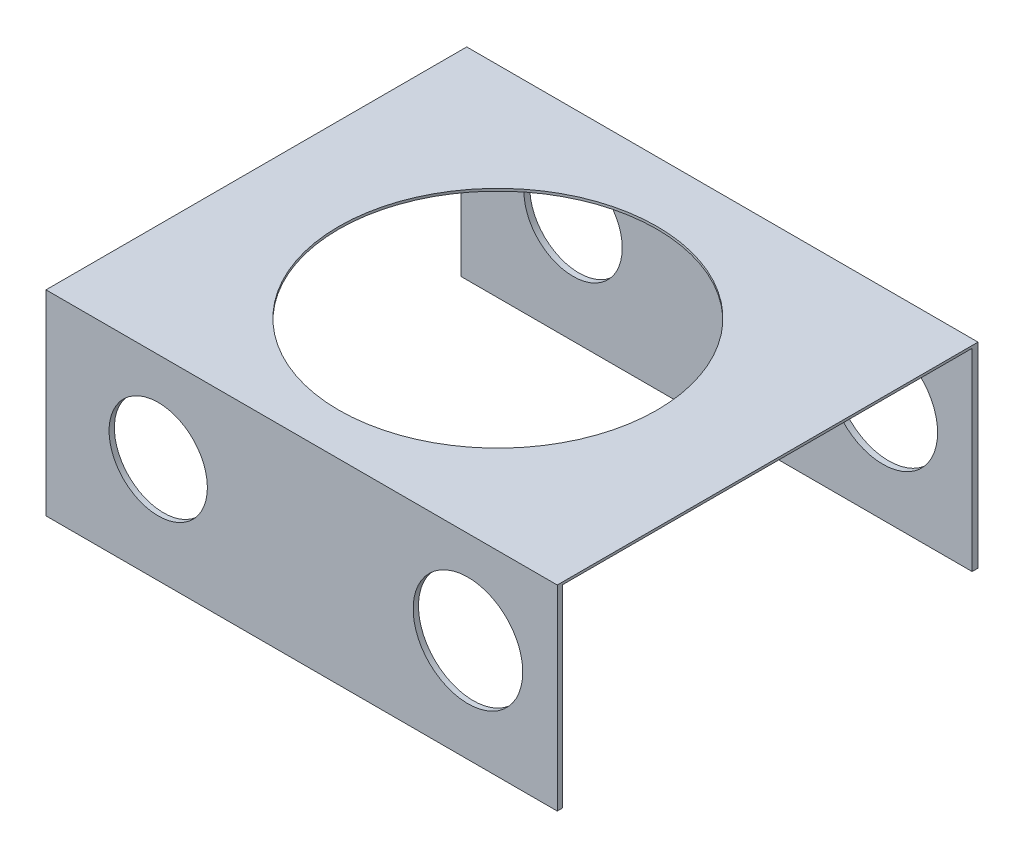
ISO-10303-21;
HEADER;
FILE_DESCRIPTION(('STEP AP214'),'2;1');
FILE_NAME('part.step','',(''),(''),'','','');
FILE_SCHEMA(('AUTOMOTIVE_DESIGN { 1 0 10303 214 1 1 1 1 }'));
ENDSEC;
DATA;
#1=APPLICATION_CONTEXT('core data for automotive mechanical design processes');
#2=APPLICATION_PROTOCOL_DEFINITION('international standard','automotive_design',2000,#1);
#3=PRODUCT_CONTEXT('',#1,'mechanical');
#4=PRODUCT('Part','Part','',(#3));
#5=PRODUCT_RELATED_PRODUCT_CATEGORY('part','',(#4));
#6=PRODUCT_DEFINITION_FORMATION('','',#4);
#7=PRODUCT_DEFINITION_CONTEXT('part definition',#1,'design');
#8=PRODUCT_DEFINITION('design','',#6,#7);
#9=PRODUCT_DEFINITION_SHAPE('','',#8);
#10=(LENGTH_UNIT() NAMED_UNIT(*) SI_UNIT(.MILLI.,.METRE.));
#11=(NAMED_UNIT(*) PLANE_ANGLE_UNIT() SI_UNIT($,.RADIAN.));
#12=(NAMED_UNIT(*) SI_UNIT($,.STERADIAN.) SOLID_ANGLE_UNIT());
#13=UNCERTAINTY_MEASURE_WITH_UNIT(LENGTH_MEASURE(1.E-05),#10,'distance_accuracy_value','');
#14=(GEOMETRIC_REPRESENTATION_CONTEXT(3) GLOBAL_UNCERTAINTY_ASSIGNED_CONTEXT((#13)) GLOBAL_UNIT_ASSIGNED_CONTEXT((#10,
#11,#12)) REPRESENTATION_CONTEXT('',''));
#15=CARTESIAN_POINT('',(0.,0.,0.));
#16=DIRECTION('',(0.,0.,1.));
#17=DIRECTION('',(1.,0.,0.));
#18=AXIS2_PLACEMENT_3D('',#15,#16,#17);
#19=CARTESIAN_POINT('',(0.,-15.,0.));
#20=DIRECTION('',(0.,1.,0.));
#21=DIRECTION('',(0.,0.,1.));
#22=AXIS2_PLACEMENT_3D('',#19,#20,#21);
#23=PLANE('',#22);
#24=DIRECTION('',(0.,0.,1.));
#25=VECTOR('',#24,1.);
#26=CARTESIAN_POINT('',(-45.1710778309643,-15.,1.54135324161621E-13));
#27=LINE('',#26,#25);
#28=CARTESIAN_POINT('',(-45.1710778309643,-15.,-39.5079014077137));
#29=VERTEX_POINT('',#28);
#30=CARTESIAN_POINT('',(-45.1710778309644,-15.,-38.45203678224));
#31=VERTEX_POINT('',#30);
#32=EDGE_CURVE('E108',#29,#31,#27,.T.);
#33=ORIENTED_EDGE('',*,*,#32,.F.);
#34=DIRECTION('',(1.,0.,0.));
#35=VECTOR('',#34,1.);
#36=CARTESIAN_POINT('',(0.,-15.,-39.5079014077137));
#37=LINE('',#36,#35);
#38=CARTESIAN_POINT('',(46.7439487612496,-15.,-39.5079014077137));
#39=VERTEX_POINT('',#38);
#40=EDGE_CURVE('E121',#29,#39,#37,.T.);
#41=ORIENTED_EDGE('',*,*,#40,.T.);
#42=DIRECTION('',(0.,0.,1.));
#43=VECTOR('',#42,1.);
#44=CARTESIAN_POINT('',(46.7439487612496,-15.,0.));
#45=LINE('',#44,#43);
#46=CARTESIAN_POINT('',(46.7439487612496,-15.,-38.45203678224));
#47=VERTEX_POINT('',#46);
#48=EDGE_CURVE('E132',#39,#47,#45,.T.);
#49=ORIENTED_EDGE('',*,*,#48,.T.);
#50=DIRECTION('',(-1.,0.,0.));
#51=VECTOR('',#50,1.);
#52=CARTESIAN_POINT('',(0.,-15.,-38.45203678224));
#53=LINE('',#52,#51);
#54=EDGE_CURVE('E48',#47,#31,#53,.T.);
#55=ORIENTED_EDGE('',*,*,#54,.T.);
#56=EDGE_LOOP('',(#33,#41,#49,#55));
#57=FACE_BOUND('',#56,.T.);
#58=ADVANCED_FACE('F38',(#57),#23,.F.);
#59=CARTESIAN_POINT('',(0.,-15.,36.1311257288747));
#60=DIRECTION('',(0.,0.,1.));
#61=DIRECTION('',(1.,0.,0.));
#62=AXIS2_PLACEMENT_3D('',#59,#60,#61);
#63=PLANE('',#62);
#64=CARTESIAN_POINT('',(30.686426908304,3.53131120888559,36.1311257288747));
#65=DIRECTION('',(0.,0.,1.));
#66=DIRECTION('',(1.,0.,0.));
#67=AXIS2_PLACEMENT_3D('',#64,#65,#66);
#68=CIRCLE('',#67,9.85217033037218);
#69=CARTESIAN_POINT('',(40.5385972386762,3.53131120888559,36.1311257288747));
#70=VERTEX_POINT('',#69);
#71=EDGE_CURVE('E168',#70,#70,#68,.T.);
#72=ORIENTED_EDGE('',*,*,#71,.F.);
#73=EDGE_LOOP('',(#72));
#74=FACE_BOUND('',#73,.T.);
#75=CARTESIAN_POINT('',(-24.9961801071572,3.92344224420574,36.1311257288747));
#76=DIRECTION('',(0.,0.,1.));
#77=DIRECTION('',(1.,0.,0.));
#78=AXIS2_PLACEMENT_3D('',#75,#76,#77);
#79=CIRCLE('',#78,8.83655346592237);
#80=CARTESIAN_POINT('',(-16.1596266412349,3.92344224420574,36.1311257288747));
#81=VERTEX_POINT('',#80);
#82=EDGE_CURVE('E180',#81,#81,#79,.T.);
#83=ORIENTED_EDGE('',*,*,#82,.F.);
#84=EDGE_LOOP('',(#83));
#85=FACE_BOUND('',#84,.T.);
#86=DIRECTION('',(1.,0.,0.));
#87=VECTOR('',#86,1.);
#88=CARTESIAN_POINT('',(0.,20.2,36.1311257288747));
#89=LINE('',#88,#87);
#90=CARTESIAN_POINT('',(-45.1710778309643,20.2,36.1311257288747));
#91=VERTEX_POINT('',#90);
#92=CARTESIAN_POINT('',(46.7439487612496,20.2,36.1311257288747));
#93=VERTEX_POINT('',#92);
#94=EDGE_CURVE('E222',#91,#93,#89,.T.);
#95=ORIENTED_EDGE('',*,*,#94,.F.);
#96=DIRECTION('',(0.,1.,0.));
#97=VECTOR('',#96,1.);
#98=CARTESIAN_POINT('',(-45.1710778309643,-15.,36.1311257288747));
#99=LINE('',#98,#97);
#100=CARTESIAN_POINT('',(-45.1710778309643,-15.,36.1311257288747));
#101=VERTEX_POINT('',#100);
#102=EDGE_CURVE('E116',#101,#91,#99,.T.);
#103=ORIENTED_EDGE('',*,*,#102,.F.);
#104=DIRECTION('',(1.,0.,0.));
#105=VECTOR('',#104,1.);
#106=CARTESIAN_POINT('',(0.,-15.,36.1311257288747));
#107=LINE('',#106,#105);
#108=CARTESIAN_POINT('',(46.7439487612496,-15.,36.1311257288747));
#109=VERTEX_POINT('',#108);
#110=EDGE_CURVE('E131',#101,#109,#107,.T.);
#111=ORIENTED_EDGE('',*,*,#110,.T.);
#112=DIRECTION('',(0.,1.,0.));
#113=VECTOR('',#112,1.);
#114=CARTESIAN_POINT('',(46.7439487612496,-15.,36.1311257288747));
#115=LINE('',#114,#113);
#116=EDGE_CURVE('E141',#109,#93,#115,.T.);
#117=ORIENTED_EDGE('',*,*,#116,.T.);
#118=EDGE_LOOP('',(#95,#103,#111,#117));
#119=FACE_BOUND('',#118,.T.);
#120=ADVANCED_FACE('F237',(#74,#85,#119),#63,.T.);
#121=CARTESIAN_POINT('',(0.,-15.,-39.5079014077137));
#122=DIRECTION('',(0.,0.,1.));
#123=DIRECTION('',(1.,0.,0.));
#124=AXIS2_PLACEMENT_3D('',#121,#122,#123);
#125=PLANE('',#124);
#126=CARTESIAN_POINT('',(30.686426908304,3.53131120888559,-39.5079014077137));
#127=DIRECTION('',(0.,0.,1.));
#128=DIRECTION('',(1.,0.,0.));
#129=AXIS2_PLACEMENT_3D('',#126,#127,#128);
#130=CIRCLE('',#129,9.85217033037218);
#131=CARTESIAN_POINT('',(40.5385972386762,3.53131120888559,-39.5079014077137));
#132=VERTEX_POINT('',#131);
#133=EDGE_CURVE('E160',#132,#132,#130,.T.);
#134=ORIENTED_EDGE('',*,*,#133,.T.);
#135=EDGE_LOOP('',(#134));
#136=FACE_BOUND('',#135,.T.);
#137=CARTESIAN_POINT('',(-24.9961801071572,3.92344224420574,-39.5079014077137));
#138=DIRECTION('',(0.,0.,1.));
#139=DIRECTION('',(1.,0.,0.));
#140=AXIS2_PLACEMENT_3D('',#137,#138,#139);
#141=CIRCLE('',#140,8.83655346592237);
#142=CARTESIAN_POINT('',(-16.1596266412349,3.92344224420574,-39.5079014077137));
#143=VERTEX_POINT('',#142);
#144=EDGE_CURVE('E174',#143,#143,#141,.T.);
#145=ORIENTED_EDGE('',*,*,#144,.T.);
#146=EDGE_LOOP('',(#145));
#147=FACE_BOUND('',#146,.T.);
#148=DIRECTION('',(0.,1.,0.));
#149=VECTOR('',#148,1.);
#150=CARTESIAN_POINT('',(-45.1710778309643,-15.,-39.5079014077137));
#151=LINE('',#150,#149);
#152=CARTESIAN_POINT('',(-45.1710778309643,20.2,-39.5079014077137));
#153=VERTEX_POINT('',#152);
#154=EDGE_CURVE('E105',#29,#153,#151,.T.);
#155=ORIENTED_EDGE('',*,*,#154,.T.);
#156=DIRECTION('',(1.,0.,0.));
#157=VECTOR('',#156,1.);
#158=CARTESIAN_POINT('',(0.,20.2,-39.5079014077137));
#159=LINE('',#158,#157);
#160=CARTESIAN_POINT('',(46.7439487612496,20.2,-39.5079014077137));
#161=VERTEX_POINT('',#160);
#162=EDGE_CURVE('E220',#153,#161,#159,.T.);
#163=ORIENTED_EDGE('',*,*,#162,.T.);
#164=DIRECTION('',(0.,1.,0.));
#165=VECTOR('',#164,1.);
#166=CARTESIAN_POINT('',(46.7439487612496,-15.,-39.5079014077137));
#167=LINE('',#166,#165);
#168=EDGE_CURVE('E128',#39,#161,#167,.T.);
#169=ORIENTED_EDGE('',*,*,#168,.F.);
#170=ORIENTED_EDGE('',*,*,#40,.F.);
#171=EDGE_LOOP('',(#155,#163,#169,#170));
#172=FACE_BOUND('',#171,.T.);
#173=ADVANCED_FACE('F126',(#136,#147,#172),#125,.F.);
#174=CARTESIAN_POINT('',(-45.1710778309642,-15.,35.1748319622103));
#175=VERTEX_POINT('',#174);
#176=EDGE_CURVE('E124',#175,#101,#27,.T.);
#177=ORIENTED_EDGE('',*,*,#176,.F.);
#178=DIRECTION('',(1.,0.,0.));
#179=VECTOR('',#178,1.);
#180=CARTESIAN_POINT('',(0.,-15.,35.1748319622103));
#181=LINE('',#180,#179);
#182=CARTESIAN_POINT('',(46.7439487612496,-15.,35.1748319622103));
#183=VERTEX_POINT('',#182);
#184=EDGE_CURVE('E63',#175,#183,#181,.T.);
#185=ORIENTED_EDGE('',*,*,#184,.T.);
#186=EDGE_CURVE('E137',#183,#109,#45,.T.);
#187=ORIENTED_EDGE('',*,*,#186,.T.);
#188=ORIENTED_EDGE('',*,*,#110,.F.);
#189=EDGE_LOOP('',(#177,#185,#187,#188));
#190=FACE_BOUND('',#189,.T.);
#191=ADVANCED_FACE('F231',(#190),#23,.F.);
#192=CARTESIAN_POINT('',(0.,20.2,0.));
#193=DIRECTION('',(0.,1.,0.));
#194=DIRECTION('',(0.,0.,1.));
#195=AXIS2_PLACEMENT_3D('',#192,#193,#194);
#196=PLANE('',#195);
#197=CARTESIAN_POINT('',(-0.126795961501475,20.2,-0.0622604331971949));
#198=DIRECTION('',(0.,1.,0.));
#199=DIRECTION('',(0.,0.,1.));
#200=AXIS2_PLACEMENT_3D('',#197,#198,#199);
#201=CIRCLE('',#200,28.6055857600006);
#202=CARTESIAN_POINT('',(-0.126795961501475,20.2,28.5433253268034));
#203=VERTEX_POINT('',#202);
#204=EDGE_CURVE('E154',#203,#203,#201,.T.);
#205=ORIENTED_EDGE('',*,*,#204,.F.);
#206=EDGE_LOOP('',(#205));
#207=FACE_BOUND('',#206,.T.);
#208=ORIENTED_EDGE('',*,*,#162,.F.);
#209=DIRECTION('',(0.,0.,1.));
#210=VECTOR('',#209,1.);
#211=CARTESIAN_POINT('',(-45.1710778309643,20.2,1.54135324161621E-13));
#212=LINE('',#211,#210);
#213=EDGE_CURVE('E111',#153,#91,#212,.T.);
#214=ORIENTED_EDGE('',*,*,#213,.T.);
#215=ORIENTED_EDGE('',*,*,#94,.T.);
#216=DIRECTION('',(0.,0.,1.));
#217=VECTOR('',#216,1.);
#218=CARTESIAN_POINT('',(46.7439487612496,20.2,0.));
#219=LINE('',#218,#217);
#220=EDGE_CURVE('E216',#161,#93,#219,.T.);
#221=ORIENTED_EDGE('',*,*,#220,.F.);
#222=EDGE_LOOP('',(#208,#214,#215,#221));
#223=FACE_BOUND('',#222,.T.);
#224=ADVANCED_FACE('F239',(#207,#223),#196,.T.);
#225=CARTESIAN_POINT('',(-47.2453748995997,19.7616852369703,35.1748319622103));
#226=DIRECTION('',(0.,1.,0.));
#227=DIRECTION('',(0.,0.,1.));
#228=AXIS2_PLACEMENT_3D('',#225,#226,#227);
#229=PLANE('',#228);
#230=CARTESIAN_POINT('',(-0.126795961501475,19.7616852369703,-0.0622604331971949));
#231=DIRECTION('',(0.,1.,0.));
#232=DIRECTION('',(0.,0.,1.));
#233=AXIS2_PLACEMENT_3D('',#230,#231,#232);
#234=CIRCLE('',#233,28.6055857600006);
#235=CARTESIAN_POINT('',(-0.126795961501475,19.7616852369703,28.5433253268034));
#236=VERTEX_POINT('',#235);
#237=EDGE_CURVE('E151',#236,#236,#234,.F.);
#238=ORIENTED_EDGE('',*,*,#237,.F.);
#239=EDGE_LOOP('',(#238));
#240=FACE_BOUND('',#239,.T.);
#241=DIRECTION('',(0.,0.,1.));
#242=VECTOR('',#241,1.);
#243=CARTESIAN_POINT('',(-45.1710778309642,19.7616852369703,35.1748319622103));
#244=LINE('',#243,#242);
#245=CARTESIAN_POINT('',(-45.1710778309644,19.7616852369703,-38.45203678224));
#246=VERTEX_POINT('',#245);
#247=CARTESIAN_POINT('',(-45.1710778309642,19.7616852369703,35.1748319622103));
#248=VERTEX_POINT('',#247);
#249=EDGE_CURVE('E55',#246,#248,#244,.T.);
#250=ORIENTED_EDGE('',*,*,#249,.F.);
#251=DIRECTION('',(1.,0.,0.));
#252=VECTOR('',#251,1.);
#253=CARTESIAN_POINT('',(-47.2453748995997,19.7616852369703,-38.45203678224));
#254=LINE('',#253,#252);
#255=CARTESIAN_POINT('',(46.7439487612496,19.7616852369703,-38.45203678224));
#256=VERTEX_POINT('',#255);
#257=EDGE_CURVE('E155',#246,#256,#254,.T.);
#258=ORIENTED_EDGE('',*,*,#257,.T.);
#259=DIRECTION('',(0.,0.,1.));
#260=VECTOR('',#259,1.);
#261=CARTESIAN_POINT('',(46.7439487612496,19.7616852369703,35.1748319622103));
#262=LINE('',#261,#260);
#263=CARTESIAN_POINT('',(46.7439487612496,19.7616852369703,35.1748319622103));
#264=VERTEX_POINT('',#263);
#265=EDGE_CURVE('E197',#256,#264,#262,.T.);
#266=ORIENTED_EDGE('',*,*,#265,.T.);
#267=DIRECTION('',(1.,0.,0.));
#268=VECTOR('',#267,1.);
#269=CARTESIAN_POINT('',(-47.2453748995997,19.7616852369703,35.1748319622103));
#270=LINE('',#269,#268);
#271=EDGE_CURVE('E208',#248,#264,#270,.T.);
#272=ORIENTED_EDGE('',*,*,#271,.F.);
#273=EDGE_LOOP('',(#250,#258,#266,#272));
#274=FACE_BOUND('',#273,.T.);
#275=ADVANCED_FACE('F246',(#240,#274),#229,.F.);
#276=CARTESIAN_POINT('',(-47.2453748995997,19.7616852369703,-38.45203678224));
#277=DIRECTION('',(0.,0.,-1.));
#278=DIRECTION('',(-1.,0.,0.));
#279=AXIS2_PLACEMENT_3D('',#276,#277,#278);
#280=PLANE('',#279);
#281=CARTESIAN_POINT('',(30.686426908304,3.53131120888559,-38.45203678224));
#282=DIRECTION('',(0.,0.,-1.));
#283=DIRECTION('',(-1.,0.,0.));
#284=AXIS2_PLACEMENT_3D('',#281,#282,#283);
#285=CIRCLE('',#284,9.85217033037218);
#286=CARTESIAN_POINT('',(20.8342565779318,3.53131120888559,-38.45203678224));
#287=VERTEX_POINT('',#286);
#288=EDGE_CURVE('E184',#287,#287,#285,.T.);
#289=ORIENTED_EDGE('',*,*,#288,.T.);
#290=EDGE_LOOP('',(#289));
#291=FACE_BOUND('',#290,.T.);
#292=CARTESIAN_POINT('',(-24.9961801071572,3.92344224420574,-38.45203678224));
#293=DIRECTION('',(0.,0.,-1.));
#294=DIRECTION('',(-1.,0.,0.));
#295=AXIS2_PLACEMENT_3D('',#292,#293,#294);
#296=CIRCLE('',#295,8.83655346592237);
#297=CARTESIAN_POINT('',(-33.8327335730796,3.92344224420574,-38.45203678224));
#298=VERTEX_POINT('',#297);
#299=EDGE_CURVE('E159',#298,#298,#296,.T.);
#300=ORIENTED_EDGE('',*,*,#299,.T.);
#301=EDGE_LOOP('',(#300));
#302=FACE_BOUND('',#301,.T.);
#303=DIRECTION('',(0.,1.,0.));
#304=VECTOR('',#303,1.);
#305=CARTESIAN_POINT('',(-45.1710778309644,19.7616852369703,-38.45203678224));
#306=LINE('',#305,#304);
#307=EDGE_CURVE('E192',#31,#246,#306,.T.);
#308=ORIENTED_EDGE('',*,*,#307,.F.);
#309=ORIENTED_EDGE('',*,*,#54,.F.);
#310=DIRECTION('',(0.,1.,0.));
#311=VECTOR('',#310,1.);
#312=CARTESIAN_POINT('',(46.7439487612496,19.7616852369703,-38.45203678224));
#313=LINE('',#312,#311);
#314=EDGE_CURVE('E204',#47,#256,#313,.T.);
#315=ORIENTED_EDGE('',*,*,#314,.T.);
#316=ORIENTED_EDGE('',*,*,#257,.F.);
#317=EDGE_LOOP('',(#308,#309,#315,#316));
#318=FACE_BOUND('',#317,.T.);
#319=ADVANCED_FACE('F243',(#291,#302,#318),#280,.F.);
#320=CARTESIAN_POINT('',(-47.2453748995997,19.7616852369703,35.1748319622103));
#321=DIRECTION('',(0.,0.,1.));
#322=DIRECTION('',(1.,0.,0.));
#323=AXIS2_PLACEMENT_3D('',#320,#321,#322);
#324=PLANE('',#323);
#325=CARTESIAN_POINT('',(30.686426908304,3.53131120888559,35.1748319622103));
#326=DIRECTION('',(0.,0.,1.));
#327=DIRECTION('',(1.,0.,0.));
#328=AXIS2_PLACEMENT_3D('',#325,#326,#327);
#329=CIRCLE('',#328,9.85217033037218);
#330=CARTESIAN_POINT('',(40.5385972386762,3.53131120888559,35.1748319622103));
#331=VERTEX_POINT('',#330);
#332=EDGE_CURVE('E42',#331,#331,#329,.T.);
#333=ORIENTED_EDGE('',*,*,#332,.T.);
#334=EDGE_LOOP('',(#333));
#335=FACE_BOUND('',#334,.T.);
#336=CARTESIAN_POINT('',(-24.9961801071572,3.92344224420574,35.1748319622103));
#337=DIRECTION('',(0.,0.,1.));
#338=DIRECTION('',(1.,0.,0.));
#339=AXIS2_PLACEMENT_3D('',#336,#337,#338);
#340=CIRCLE('',#339,8.83655346592237);
#341=CARTESIAN_POINT('',(-16.1596266412349,3.92344224420574,35.1748319622103));
#342=VERTEX_POINT('',#341);
#343=EDGE_CURVE('E156',#342,#342,#340,.T.);
#344=ORIENTED_EDGE('',*,*,#343,.T.);
#345=EDGE_LOOP('',(#344));
#346=FACE_BOUND('',#345,.T.);
#347=DIRECTION('',(0.,-1.,0.));
#348=VECTOR('',#347,1.);
#349=CARTESIAN_POINT('',(-45.1710778309642,19.7616852369703,35.1748319622103));
#350=LINE('',#349,#348);
#351=EDGE_CURVE('E11',#248,#175,#350,.T.);
#352=ORIENTED_EDGE('',*,*,#351,.F.);
#353=ORIENTED_EDGE('',*,*,#271,.T.);
#354=DIRECTION('',(0.,-1.,0.));
#355=VECTOR('',#354,1.);
#356=CARTESIAN_POINT('',(46.7439487612496,19.7616852369703,35.1748319622103));
#357=LINE('',#356,#355);
#358=EDGE_CURVE('E201',#264,#183,#357,.T.);
#359=ORIENTED_EDGE('',*,*,#358,.T.);
#360=ORIENTED_EDGE('',*,*,#184,.F.);
#361=EDGE_LOOP('',(#352,#353,#359,#360));
#362=FACE_BOUND('',#361,.T.);
#363=ADVANCED_FACE('F248',(#335,#346,#362),#324,.F.);
#364=CARTESIAN_POINT('',(46.7439487612496,-15.,0.));
#365=DIRECTION('',(-1.,0.,0.));
#366=DIRECTION('',(0.,0.,1.));
#367=AXIS2_PLACEMENT_3D('',#364,#365,#366);
#368=PLANE('',#367);
#369=ORIENTED_EDGE('',*,*,#265,.F.);
#370=ORIENTED_EDGE('',*,*,#314,.F.);
#371=ORIENTED_EDGE('',*,*,#48,.F.);
#372=ORIENTED_EDGE('',*,*,#168,.T.);
#373=ORIENTED_EDGE('',*,*,#220,.T.);
#374=ORIENTED_EDGE('',*,*,#116,.F.);
#375=ORIENTED_EDGE('',*,*,#186,.F.);
#376=ORIENTED_EDGE('',*,*,#358,.F.);
#377=EDGE_LOOP('',(#369,#370,#371,#372,#373,#374,#375,#376));
#378=FACE_BOUND('',#377,.T.);
#379=ADVANCED_FACE('F235',(#378),#368,.F.);
#380=CARTESIAN_POINT('',(-0.126795961501475,-15.,-0.0622604331971949));
#381=DIRECTION('',(0.,1.,0.));
#382=DIRECTION('',(0.,0.,1.));
#383=AXIS2_PLACEMENT_3D('',#380,#381,#382);
#384=CYLINDRICAL_SURFACE('',#383,28.6055857600006);
#385=ORIENTED_EDGE('',*,*,#237,.T.);
#386=EDGE_LOOP('',(#385));
#387=FACE_BOUND('',#386,.T.);
#388=ORIENTED_EDGE('',*,*,#204,.T.);
#389=EDGE_LOOP('',(#388));
#390=FACE_BOUND('',#389,.T.);
#391=ADVANCED_FACE('F40',(#387,#390),#384,.F.);
#392=CARTESIAN_POINT('',(-45.1710778309643,-15.,1.54135324161621E-13));
#393=DIRECTION('',(-1.,0.,0.));
#394=DIRECTION('',(0.,0.,1.));
#395=AXIS2_PLACEMENT_3D('',#392,#393,#394);
#396=PLANE('',#395);
#397=ORIENTED_EDGE('',*,*,#154,.F.);
#398=ORIENTED_EDGE('',*,*,#32,.T.);
#399=ORIENTED_EDGE('',*,*,#307,.T.);
#400=ORIENTED_EDGE('',*,*,#249,.T.);
#401=ORIENTED_EDGE('',*,*,#351,.T.);
#402=ORIENTED_EDGE('',*,*,#176,.T.);
#403=ORIENTED_EDGE('',*,*,#102,.T.);
#404=ORIENTED_EDGE('',*,*,#213,.F.);
#405=EDGE_LOOP('',(#397,#398,#399,#400,#401,#402,#403,#404));
#406=FACE_BOUND('',#405,.T.);
#407=ADVANCED_FACE('F107',(#406),#396,.T.);
#408=CARTESIAN_POINT('',(-24.9961801071572,3.92344224420574,-39.5079014077137));
#409=DIRECTION('',(0.,0.,1.));
#410=DIRECTION('',(1.,0.,0.));
#411=AXIS2_PLACEMENT_3D('',#408,#409,#410);
#412=CYLINDRICAL_SURFACE('',#411,8.83655346592237);
#413=ORIENTED_EDGE('',*,*,#82,.T.);
#414=EDGE_LOOP('',(#413));
#415=FACE_BOUND('',#414,.T.);
#416=ORIENTED_EDGE('',*,*,#343,.F.);
#417=EDGE_LOOP('',(#416));
#418=FACE_BOUND('',#417,.T.);
#419=ADVANCED_FACE('F258',(#415,#418),#412,.F.);
#420=CARTESIAN_POINT('',(30.686426908304,3.53131120888559,-39.5079014077137));
#421=DIRECTION('',(0.,0.,1.));
#422=DIRECTION('',(1.,0.,0.));
#423=AXIS2_PLACEMENT_3D('',#420,#421,#422);
#424=CYLINDRICAL_SURFACE('',#423,9.85217033037218);
#425=ORIENTED_EDGE('',*,*,#71,.T.);
#426=EDGE_LOOP('',(#425));
#427=FACE_BOUND('',#426,.T.);
#428=ORIENTED_EDGE('',*,*,#332,.F.);
#429=EDGE_LOOP('',(#428));
#430=FACE_BOUND('',#429,.T.);
#431=ADVANCED_FACE('F255',(#427,#430),#424,.F.);
#432=ORIENTED_EDGE('',*,*,#144,.F.);
#433=EDGE_LOOP('',(#432));
#434=FACE_BOUND('',#433,.T.);
#435=ORIENTED_EDGE('',*,*,#299,.F.);
#436=EDGE_LOOP('',(#435));
#437=FACE_BOUND('',#436,.T.);
#438=ADVANCED_FACE('F257',(#434,#437),#412,.F.);
#439=ORIENTED_EDGE('',*,*,#133,.F.);
#440=EDGE_LOOP('',(#439));
#441=FACE_BOUND('',#440,.T.);
#442=ORIENTED_EDGE('',*,*,#288,.F.);
#443=EDGE_LOOP('',(#442));
#444=FACE_BOUND('',#443,.T.);
#445=ADVANCED_FACE('F261',(#441,#444),#424,.F.);
#446=CLOSED_SHELL('',(#58,#120,#173,#191,#224,#275,#319,#363,#379,#391,#407,#419,#431,#438,#445));
#447=MANIFOLD_SOLID_BREP('B2',#446);
#448=ADVANCED_BREP_SHAPE_REPRESENTATION('',(#18,#447),#14);
#449=SHAPE_DEFINITION_REPRESENTATION(#9,#448);
ENDSEC;
END-ISO-10303-21;
